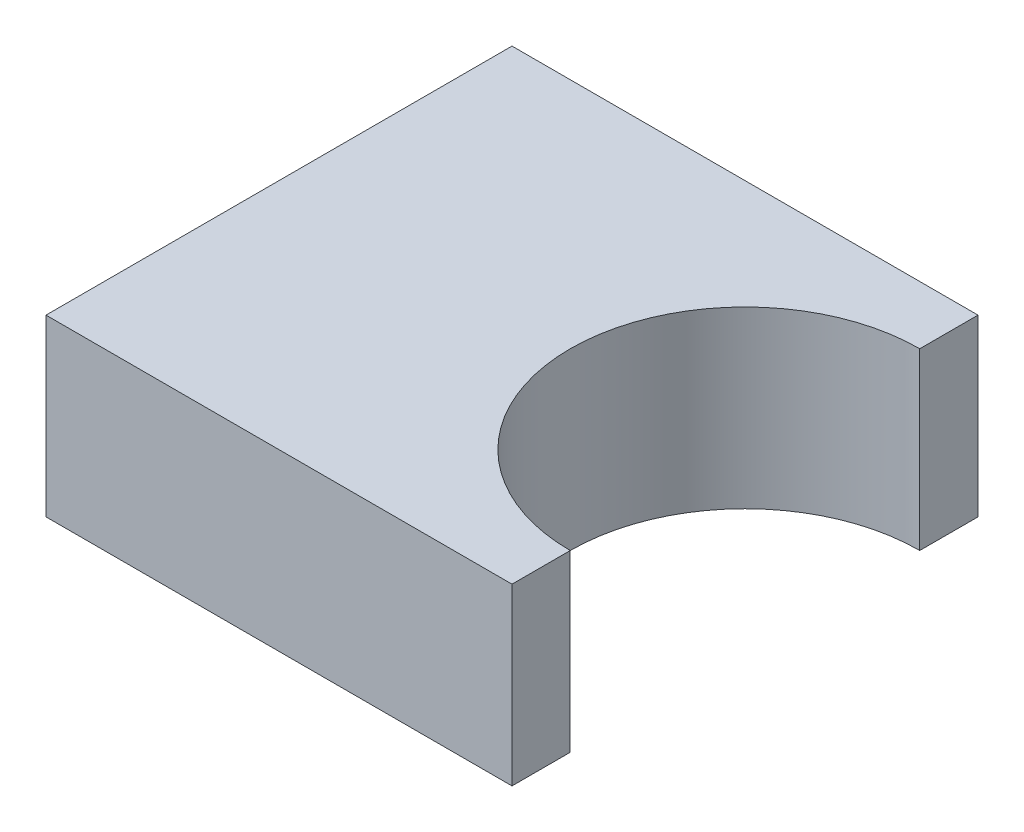
ISO-10303-21;
HEADER;
FILE_DESCRIPTION(('STEP AP214'),'2;1');
FILE_NAME('part.step','',(''),(''),'','','');
FILE_SCHEMA(('AUTOMOTIVE_DESIGN { 1 0 10303 214 1 1 1 1 }'));
ENDSEC;
DATA;
#1=APPLICATION_CONTEXT('core data for automotive mechanical design processes');
#2=APPLICATION_PROTOCOL_DEFINITION('international standard','automotive_design',2000,#1);
#3=PRODUCT_CONTEXT('',#1,'mechanical');
#4=PRODUCT('Part','Part','',(#3));
#5=PRODUCT_RELATED_PRODUCT_CATEGORY('part','',(#4));
#6=PRODUCT_DEFINITION_FORMATION('','',#4);
#7=PRODUCT_DEFINITION_CONTEXT('part definition',#1,'design');
#8=PRODUCT_DEFINITION('design','',#6,#7);
#9=PRODUCT_DEFINITION_SHAPE('','',#8);
#10=(LENGTH_UNIT() NAMED_UNIT(*) SI_UNIT(.MILLI.,.METRE.));
#11=(NAMED_UNIT(*) PLANE_ANGLE_UNIT() SI_UNIT($,.RADIAN.));
#12=(NAMED_UNIT(*) SI_UNIT($,.STERADIAN.) SOLID_ANGLE_UNIT());
#13=UNCERTAINTY_MEASURE_WITH_UNIT(LENGTH_MEASURE(1.E-05),#10,'distance_accuracy_value','');
#14=(GEOMETRIC_REPRESENTATION_CONTEXT(3) GLOBAL_UNCERTAINTY_ASSIGNED_CONTEXT((#13)) GLOBAL_UNIT_ASSIGNED_CONTEXT((#10,
#11,#12)) REPRESENTATION_CONTEXT('',''));
#15=CARTESIAN_POINT('',(0.,0.,0.));
#16=DIRECTION('',(0.,0.,1.));
#17=DIRECTION('',(1.,0.,0.));
#18=AXIS2_PLACEMENT_3D('',#15,#16,#17);
#19=CARTESIAN_POINT('',(800.,0.,800.));
#20=DIRECTION('',(-1.,0.,0.));
#21=DIRECTION('',(0.,0.,1.));
#22=AXIS2_PLACEMENT_3D('',#19,#20,#21);
#23=PLANE('',#22);
#24=DIRECTION('',(0.,0.,-1.));
#25=VECTOR('',#24,1.);
#26=CARTESIAN_POINT('',(800.,0.,800.));
#27=LINE('',#26,#25);
#28=CARTESIAN_POINT('',(800.,0.,800.));
#29=VERTEX_POINT('',#28);
#30=CARTESIAN_POINT('',(800.,0.,700.));
#31=VERTEX_POINT('',#30);
#32=EDGE_CURVE('E108',#29,#31,#27,.T.);
#33=ORIENTED_EDGE('',*,*,#32,.T.);
#34=DIRECTION('',(0.,1.,0.));
#35=VECTOR('',#34,1.);
#36=CARTESIAN_POINT('',(800.,-200.,700.));
#37=LINE('',#36,#35);
#38=CARTESIAN_POINT('',(800.,300.,700.));
#39=VERTEX_POINT('',#38);
#40=EDGE_CURVE('E99',#31,#39,#37,.T.);
#41=ORIENTED_EDGE('',*,*,#40,.T.);
#42=DIRECTION('',(0.,0.,-1.));
#43=VECTOR('',#42,1.);
#44=CARTESIAN_POINT('',(800.,300.,800.));
#45=LINE('',#44,#43);
#46=CARTESIAN_POINT('',(800.,300.,800.));
#47=VERTEX_POINT('',#46);
#48=EDGE_CURVE('E107',#47,#39,#45,.T.);
#49=ORIENTED_EDGE('',*,*,#48,.F.);
#50=DIRECTION('',(0.,1.,0.));
#51=VECTOR('',#50,1.);
#52=CARTESIAN_POINT('',(800.,0.,800.));
#53=LINE('',#52,#51);
#54=EDGE_CURVE('E152',#29,#47,#53,.T.);
#55=ORIENTED_EDGE('',*,*,#54,.F.);
#56=EDGE_LOOP('',(#33,#41,#49,#55));
#57=FACE_BOUND('',#56,.T.);
#58=ADVANCED_FACE('F38',(#57),#23,.F.);
#59=CARTESIAN_POINT('',(0.,0.,800.));
#60=DIRECTION('',(1.,0.,0.));
#61=DIRECTION('',(0.,0.,-1.));
#62=AXIS2_PLACEMENT_3D('',#59,#60,#61);
#63=PLANE('',#62);
#64=DIRECTION('',(0.,-1.,0.));
#65=VECTOR('',#64,1.);
#66=CARTESIAN_POINT('',(0.,0.,0.));
#67=LINE('',#66,#65);
#68=CARTESIAN_POINT('',(0.,300.,0.));
#69=VERTEX_POINT('',#68);
#70=CARTESIAN_POINT('',(0.,0.,0.));
#71=VERTEX_POINT('',#70);
#72=EDGE_CURVE('E110',#69,#71,#67,.T.);
#73=ORIENTED_EDGE('',*,*,#72,.T.);
#74=DIRECTION('',(0.,0.,-1.));
#75=VECTOR('',#74,1.);
#76=CARTESIAN_POINT('',(0.,0.,800.));
#77=LINE('',#76,#75);
#78=CARTESIAN_POINT('',(0.,0.,800.));
#79=VERTEX_POINT('',#78);
#80=EDGE_CURVE('E47',#79,#71,#77,.T.);
#81=ORIENTED_EDGE('',*,*,#80,.F.);
#82=DIRECTION('',(0.,-1.,0.));
#83=VECTOR('',#82,1.);
#84=CARTESIAN_POINT('',(0.,0.,800.));
#85=LINE('',#84,#83);
#86=CARTESIAN_POINT('',(0.,300.,800.));
#87=VERTEX_POINT('',#86);
#88=EDGE_CURVE('E148',#87,#79,#85,.T.);
#89=ORIENTED_EDGE('',*,*,#88,.F.);
#90=DIRECTION('',(0.,0.,-1.));
#91=VECTOR('',#90,1.);
#92=CARTESIAN_POINT('',(0.,300.,800.));
#93=LINE('',#92,#91);
#94=EDGE_CURVE('E121',#87,#69,#93,.T.);
#95=ORIENTED_EDGE('',*,*,#94,.T.);
#96=EDGE_LOOP('',(#73,#81,#89,#95));
#97=FACE_BOUND('',#96,.T.);
#98=ADVANCED_FACE('F40',(#97),#63,.F.);
#99=CARTESIAN_POINT('',(0.,0.,800.));
#100=DIRECTION('',(0.,1.,0.));
#101=DIRECTION('',(0.,0.,1.));
#102=AXIS2_PLACEMENT_3D('',#99,#100,#101);
#103=PLANE('',#102);
#104=CARTESIAN_POINT('',(800.,0.,99.9999999999999));
#105=VERTEX_POINT('',#104);
#106=CARTESIAN_POINT('',(800.,0.,0.));
#107=VERTEX_POINT('',#106);
#108=EDGE_CURVE('E115',#105,#107,#27,.T.);
#109=ORIENTED_EDGE('',*,*,#108,.F.);
#110=CARTESIAN_POINT('',(800.,0.,400.));
#111=DIRECTION('',(0.,1.,0.));
#112=DIRECTION('',(0.,0.,1.));
#113=AXIS2_PLACEMENT_3D('',#110,#111,#112);
#114=CIRCLE('',#113,300.);
#115=EDGE_CURVE('E111',#105,#31,#114,.T.);
#116=ORIENTED_EDGE('',*,*,#115,.T.);
#117=ORIENTED_EDGE('',*,*,#32,.F.);
#118=DIRECTION('',(1.,0.,0.));
#119=VECTOR('',#118,1.);
#120=CARTESIAN_POINT('',(0.,0.,800.));
#121=LINE('',#120,#119);
#122=EDGE_CURVE('E90',#79,#29,#121,.T.);
#123=ORIENTED_EDGE('',*,*,#122,.F.);
#124=ORIENTED_EDGE('',*,*,#80,.T.);
#125=DIRECTION('',(1.,0.,0.));
#126=VECTOR('',#125,1.);
#127=CARTESIAN_POINT('',(0.,0.,0.));
#128=LINE('',#127,#126);
#129=EDGE_CURVE('E131',#71,#107,#128,.T.);
#130=ORIENTED_EDGE('',*,*,#129,.T.);
#131=EDGE_LOOP('',(#109,#116,#117,#123,#124,#130));
#132=FACE_BOUND('',#131,.T.);
#133=ADVANCED_FACE('F130',(#132),#103,.F.);
#134=CARTESIAN_POINT('',(800.,300.,99.9999999999999));
#135=VERTEX_POINT('',#134);
#136=CARTESIAN_POINT('',(800.,300.,0.));
#137=VERTEX_POINT('',#136);
#138=EDGE_CURVE('E116',#135,#137,#45,.T.);
#139=ORIENTED_EDGE('',*,*,#138,.F.);
#140=DIRECTION('',(0.,1.,0.));
#141=VECTOR('',#140,1.);
#142=CARTESIAN_POINT('',(800.,-200.,99.9999999999999));
#143=LINE('',#142,#141);
#144=EDGE_CURVE('E54',#135,#105,#143,.F.);
#145=ORIENTED_EDGE('',*,*,#144,.T.);
#146=ORIENTED_EDGE('',*,*,#108,.T.);
#147=DIRECTION('',(0.,1.,0.));
#148=VECTOR('',#147,1.);
#149=CARTESIAN_POINT('',(800.,0.,0.));
#150=LINE('',#149,#148);
#151=EDGE_CURVE('E140',#107,#137,#150,.T.);
#152=ORIENTED_EDGE('',*,*,#151,.T.);
#153=EDGE_LOOP('',(#139,#145,#146,#152));
#154=FACE_BOUND('',#153,.T.);
#155=ADVANCED_FACE('F163',(#154),#23,.F.);
#156=CARTESIAN_POINT('',(0.,300.,800.));
#157=DIRECTION('',(0.,-1.,0.));
#158=DIRECTION('',(0.,0.,-1.));
#159=AXIS2_PLACEMENT_3D('',#156,#157,#158);
#160=PLANE('',#159);
#161=ORIENTED_EDGE('',*,*,#48,.T.);
#162=CARTESIAN_POINT('',(800.,300.,400.));
#163=DIRECTION('',(0.,-1.,0.));
#164=DIRECTION('',(0.,0.,-1.));
#165=AXIS2_PLACEMENT_3D('',#162,#163,#164);
#166=CIRCLE('',#165,300.);
#167=EDGE_CURVE('E11',#39,#135,#166,.T.);
#168=ORIENTED_EDGE('',*,*,#167,.T.);
#169=ORIENTED_EDGE('',*,*,#138,.T.);
#170=DIRECTION('',(-1.,0.,0.));
#171=VECTOR('',#170,1.);
#172=CARTESIAN_POINT('',(0.,300.,0.));
#173=LINE('',#172,#171);
#174=EDGE_CURVE('E82',#137,#69,#173,.T.);
#175=ORIENTED_EDGE('',*,*,#174,.T.);
#176=ORIENTED_EDGE('',*,*,#94,.F.);
#177=DIRECTION('',(-1.,0.,0.));
#178=VECTOR('',#177,1.);
#179=CARTESIAN_POINT('',(0.,300.,800.));
#180=LINE('',#179,#178);
#181=EDGE_CURVE('E62',#47,#87,#180,.T.);
#182=ORIENTED_EDGE('',*,*,#181,.F.);
#183=EDGE_LOOP('',(#161,#168,#169,#175,#176,#182));
#184=FACE_BOUND('',#183,.T.);
#185=ADVANCED_FACE('F113',(#184),#160,.F.);
#186=CARTESIAN_POINT('',(0.,0.,800.));
#187=DIRECTION('',(0.,0.,-1.));
#188=DIRECTION('',(-1.,0.,0.));
#189=AXIS2_PLACEMENT_3D('',#186,#187,#188);
#190=PLANE('',#189);
#191=ORIENTED_EDGE('',*,*,#88,.T.);
#192=ORIENTED_EDGE('',*,*,#122,.T.);
#193=ORIENTED_EDGE('',*,*,#54,.T.);
#194=ORIENTED_EDGE('',*,*,#181,.T.);
#195=EDGE_LOOP('',(#191,#192,#193,#194));
#196=FACE_BOUND('',#195,.T.);
#197=ADVANCED_FACE('F158',(#196),#190,.F.);
#198=CARTESIAN_POINT('',(0.,0.,0.));
#199=DIRECTION('',(0.,0.,-1.));
#200=DIRECTION('',(-1.,0.,0.));
#201=AXIS2_PLACEMENT_3D('',#198,#199,#200);
#202=PLANE('',#201);
#203=ORIENTED_EDGE('',*,*,#72,.F.);
#204=ORIENTED_EDGE('',*,*,#174,.F.);
#205=ORIENTED_EDGE('',*,*,#151,.F.);
#206=ORIENTED_EDGE('',*,*,#129,.F.);
#207=EDGE_LOOP('',(#203,#204,#205,#206));
#208=FACE_BOUND('',#207,.T.);
#209=ADVANCED_FACE('F164',(#208),#202,.T.);
#210=CARTESIAN_POINT('',(800.,-200.,400.));
#211=DIRECTION('',(0.,1.,0.));
#212=DIRECTION('',(0.,0.,1.));
#213=AXIS2_PLACEMENT_3D('',#210,#211,#212);
#214=CYLINDRICAL_SURFACE('',#213,300.);
#215=ORIENTED_EDGE('',*,*,#115,.F.);
#216=ORIENTED_EDGE('',*,*,#144,.F.);
#217=ORIENTED_EDGE('',*,*,#167,.F.);
#218=ORIENTED_EDGE('',*,*,#40,.F.);
#219=EDGE_LOOP('',(#215,#216,#217,#218));
#220=FACE_BOUND('',#219,.T.);
#221=ADVANCED_FACE('F98',(#220),#214,.F.);
#222=CLOSED_SHELL('',(#58,#98,#133,#155,#185,#197,#209,#221));
#223=MANIFOLD_SOLID_BREP('B2',#222);
#224=ADVANCED_BREP_SHAPE_REPRESENTATION('',(#18,#223),#14);
#225=SHAPE_DEFINITION_REPRESENTATION(#9,#224);
ENDSEC;
END-ISO-10303-21;
